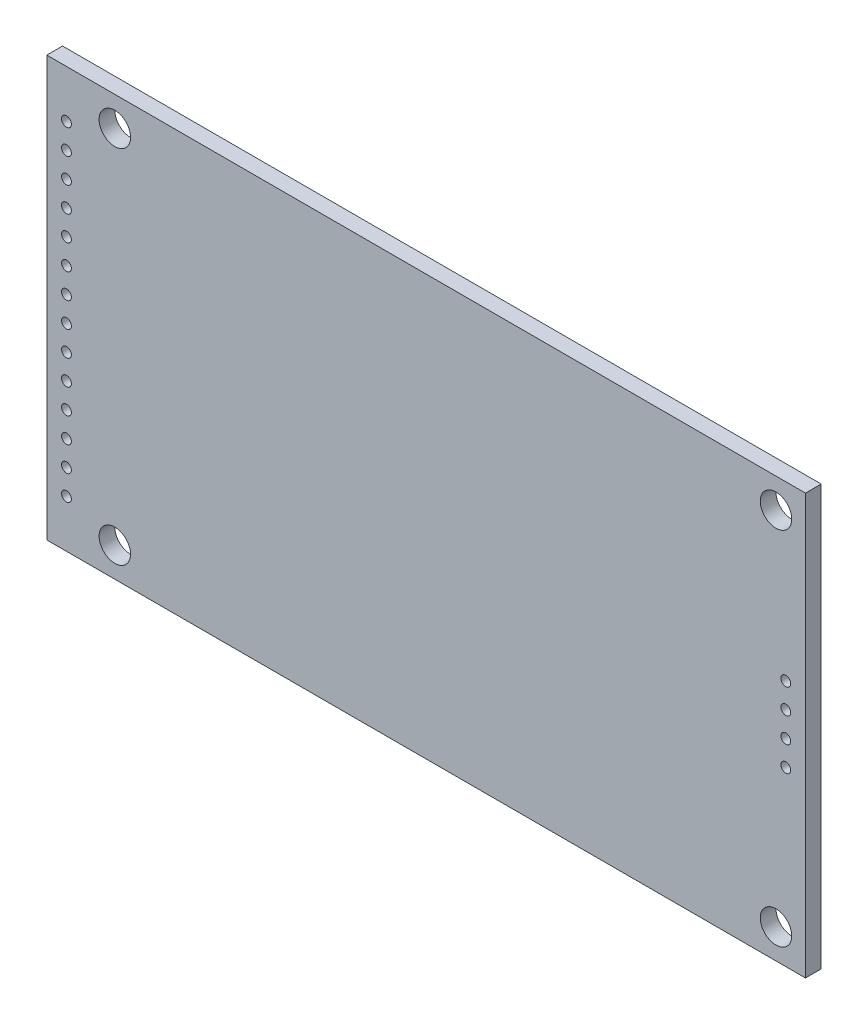
ISO-10303-21;
HEADER;
FILE_DESCRIPTION(('STEP AP214'),'2;1');
FILE_NAME('part.step','',(''),(''),'','','');
FILE_SCHEMA(('AUTOMOTIVE_DESIGN { 1 0 10303 214 1 1 1 1 }'));
ENDSEC;
DATA;
#1=APPLICATION_CONTEXT('core data for automotive mechanical design processes');
#2=APPLICATION_PROTOCOL_DEFINITION('international standard','automotive_design',2000,#1);
#3=PRODUCT_CONTEXT('',#1,'mechanical');
#4=PRODUCT('Part','Part','',(#3));
#5=PRODUCT_RELATED_PRODUCT_CATEGORY('part','',(#4));
#6=PRODUCT_DEFINITION_FORMATION('','',#4);
#7=PRODUCT_DEFINITION_CONTEXT('part definition',#1,'design');
#8=PRODUCT_DEFINITION('design','',#6,#7);
#9=PRODUCT_DEFINITION_SHAPE('','',#8);
#10=(LENGTH_UNIT() NAMED_UNIT(*) SI_UNIT(.MILLI.,.METRE.));
#11=(NAMED_UNIT(*) PLANE_ANGLE_UNIT() SI_UNIT($,.RADIAN.));
#12=(NAMED_UNIT(*) SI_UNIT($,.STERADIAN.) SOLID_ANGLE_UNIT());
#13=UNCERTAINTY_MEASURE_WITH_UNIT(LENGTH_MEASURE(1.E-05),#10,'distance_accuracy_value','');
#14=(GEOMETRIC_REPRESENTATION_CONTEXT(3) GLOBAL_UNCERTAINTY_ASSIGNED_CONTEXT((#13)) GLOBAL_UNIT_ASSIGNED_CONTEXT((#10,
#11,#12)) REPRESENTATION_CONTEXT('',''));
#15=CARTESIAN_POINT('',(0.,0.,0.));
#16=DIRECTION('',(0.,0.,1.));
#17=DIRECTION('',(1.,0.,0.));
#18=AXIS2_PLACEMENT_3D('',#15,#16,#17);
#19=CARTESIAN_POINT('',(2.45403826108749,0.614093810952889,0.));
#20=DIRECTION('',(0.,0.,1.));
#21=DIRECTION('',(1.,0.,0.));
#22=AXIS2_PLACEMENT_3D('',#19,#20,#21);
#23=PLANE('',#22);
#24=CARTESIAN_POINT('',(39.0440382610875,1.88409381095289,0.));
#25=DIRECTION('',(0.,0.,-1.));
#26=DIRECTION('',(1.,0.,0.));
#27=AXIS2_PLACEMENT_3D('',#24,#25,#26);
#28=CIRCLE('',#27,0.5);
#29=CARTESIAN_POINT('',(38.5440382610875,1.88409381095289,0.));
#30=VERTEX_POINT('',#29);
#31=EDGE_CURVE('E260',#30,#30,#28,.T.);
#32=ORIENTED_EDGE('',*,*,#31,.F.);
#33=EDGE_LOOP('',(#32));
#34=FACE_BOUND('',#33,.T.);
#35=CARTESIAN_POINT('',(-34.1359617389125,-8.27590618904711,0.));
#36=DIRECTION('',(0.,0.,-1.));
#37=DIRECTION('',(1.,0.,0.));
#38=AXIS2_PLACEMENT_3D('',#35,#36,#37);
#39=CIRCLE('',#38,0.5);
#40=CARTESIAN_POINT('',(-34.6359617389125,-8.27590618904711,0.));
#41=VERTEX_POINT('',#40);
#42=EDGE_CURVE('E321',#41,#41,#39,.T.);
#43=ORIENTED_EDGE('',*,*,#42,.F.);
#44=EDGE_LOOP('',(#43));
#45=FACE_BOUND('',#44,.T.);
#46=CARTESIAN_POINT('',(-34.1359617389125,4.42409381095289,0.));
#47=DIRECTION('',(0.,0.,-1.));
#48=DIRECTION('',(1.,0.,0.));
#49=AXIS2_PLACEMENT_3D('',#46,#47,#48);
#50=CIRCLE('',#49,0.5);
#51=CARTESIAN_POINT('',(-34.6359617389125,4.42409381095289,0.));
#52=VERTEX_POINT('',#51);
#53=EDGE_CURVE('E370',#52,#52,#50,.T.);
#54=ORIENTED_EDGE('',*,*,#53,.F.);
#55=EDGE_LOOP('',(#54));
#56=FACE_BOUND('',#55,.T.);
#57=CARTESIAN_POINT('',(-29.2152112296125,18.9740938109529,0.));
#58=DIRECTION('',(0.,0.,-1.));
#59=DIRECTION('',(1.,0.,0.));
#60=AXIS2_PLACEMENT_3D('',#57,#58,#59);
#61=CIRCLE('',#60,1.6);
#62=CARTESIAN_POINT('',(-30.8152112296125,18.9740938109529,0.));
#63=VERTEX_POINT('',#62);
#64=EDGE_CURVE('E297',#63,#63,#61,.T.);
#65=ORIENTED_EDGE('',*,*,#64,.F.);
#66=EDGE_LOOP('',(#65));
#67=FACE_BOUND('',#66,.T.);
#68=CARTESIAN_POINT('',(-34.1359617389125,6.96409381095289,0.));
#69=DIRECTION('',(0.,0.,-1.));
#70=DIRECTION('',(1.,0.,0.));
#71=AXIS2_PLACEMENT_3D('',#68,#69,#70);
#72=CIRCLE('',#71,0.5);
#73=CARTESIAN_POINT('',(-34.6359617389125,6.96409381095289,0.));
#74=VERTEX_POINT('',#73);
#75=EDGE_CURVE('E306',#74,#74,#72,.T.);
#76=ORIENTED_EDGE('',*,*,#75,.F.);
#77=EDGE_LOOP('',(#76));
#78=FACE_BOUND('',#77,.T.);
#79=CARTESIAN_POINT('',(38.0440382610875,-17.7459061890471,0.));
#80=DIRECTION('',(0.,0.,-1.));
#81=DIRECTION('',(1.,0.,0.));
#82=AXIS2_PLACEMENT_3D('',#79,#80,#81);
#83=CIRCLE('',#82,1.6);
#84=CARTESIAN_POINT('',(36.4440382610875,-17.7459061890471,0.));
#85=VERTEX_POINT('',#84);
#86=EDGE_CURVE('E144',#85,#85,#83,.T.);
#87=ORIENTED_EDGE('',*,*,#86,.F.);
#88=EDGE_LOOP('',(#87));
#89=FACE_BOUND('',#88,.T.);
#90=CARTESIAN_POINT('',(38.0440382610875,18.9740938109529,0.));
#91=DIRECTION('',(0.,0.,-1.));
#92=DIRECTION('',(1.,0.,0.));
#93=AXIS2_PLACEMENT_3D('',#90,#91,#92);
#94=CIRCLE('',#93,1.6);
#95=CARTESIAN_POINT('',(36.4440382610875,18.9740938109529,0.));
#96=VERTEX_POINT('',#95);
#97=EDGE_CURVE('E127',#96,#96,#94,.T.);
#98=ORIENTED_EDGE('',*,*,#97,.F.);
#99=EDGE_LOOP('',(#98));
#100=FACE_BOUND('',#99,.T.);
#101=CARTESIAN_POINT('',(-34.1359617389125,9.50409381095289,0.));
#102=DIRECTION('',(0.,0.,-1.));
#103=DIRECTION('',(1.,0.,0.));
#104=AXIS2_PLACEMENT_3D('',#101,#102,#103);
#105=CIRCLE('',#104,0.5);
#106=CARTESIAN_POINT('',(-34.6359617389125,9.50409381095289,0.));
#107=VERTEX_POINT('',#106);
#108=EDGE_CURVE('E348',#107,#107,#105,.T.);
#109=ORIENTED_EDGE('',*,*,#108,.F.);
#110=EDGE_LOOP('',(#109));
#111=FACE_BOUND('',#110,.T.);
#112=CARTESIAN_POINT('',(39.0440382610875,-3.19590618904711,0.));
#113=DIRECTION('',(0.,0.,-1.));
#114=DIRECTION('',(1.,0.,0.));
#115=AXIS2_PLACEMENT_3D('',#112,#113,#114);
#116=CIRCLE('',#115,0.5);
#117=CARTESIAN_POINT('',(38.5440382610875,-3.19590618904711,0.));
#118=VERTEX_POINT('',#117);
#119=EDGE_CURVE('E166',#118,#118,#116,.T.);
#120=ORIENTED_EDGE('',*,*,#119,.F.);
#121=EDGE_LOOP('',(#120));
#122=FACE_BOUND('',#121,.T.);
#123=CARTESIAN_POINT('',(39.0440382610875,4.42409381095289,0.));
#124=DIRECTION('',(0.,0.,-1.));
#125=DIRECTION('',(1.,0.,0.));
#126=AXIS2_PLACEMENT_3D('',#123,#124,#125);
#127=CIRCLE('',#126,0.5);
#128=CARTESIAN_POINT('',(38.5440382610875,4.42409381095289,0.));
#129=VERTEX_POINT('',#128);
#130=EDGE_CURVE('E172',#129,#129,#127,.T.);
#131=ORIENTED_EDGE('',*,*,#130,.F.);
#132=EDGE_LOOP('',(#131));
#133=FACE_BOUND('',#132,.T.);
#134=CARTESIAN_POINT('',(39.0440382610875,-0.655906189047109,0.));
#135=DIRECTION('',(0.,0.,-1.));
#136=DIRECTION('',(1.,0.,0.));
#137=AXIS2_PLACEMENT_3D('',#134,#135,#136);
#138=CIRCLE('',#137,0.5);
#139=CARTESIAN_POINT('',(38.5440382610875,-0.655906189047109,0.));
#140=VERTEX_POINT('',#139);
#141=EDGE_CURVE('E317',#140,#140,#138,.T.);
#142=ORIENTED_EDGE('',*,*,#141,.F.);
#143=EDGE_LOOP('',(#142));
#144=FACE_BOUND('',#143,.T.);
#145=CARTESIAN_POINT('',(-34.1359617389125,12.0440938109529,0.));
#146=DIRECTION('',(0.,0.,-1.));
#147=DIRECTION('',(1.,0.,0.));
#148=AXIS2_PLACEMENT_3D('',#145,#146,#147);
#149=CIRCLE('',#148,0.5);
#150=CARTESIAN_POINT('',(-34.6359617389125,12.0440938109529,0.));
#151=VERTEX_POINT('',#150);
#152=EDGE_CURVE('E237',#151,#151,#149,.T.);
#153=ORIENTED_EDGE('',*,*,#152,.F.);
#154=EDGE_LOOP('',(#153));
#155=FACE_BOUND('',#154,.T.);
#156=CARTESIAN_POINT('',(-34.1359617389125,-13.3559061890471,0.));
#157=DIRECTION('',(0.,0.,-1.));
#158=DIRECTION('',(1.,0.,0.));
#159=AXIS2_PLACEMENT_3D('',#156,#157,#158);
#160=CIRCLE('',#159,0.5);
#161=CARTESIAN_POINT('',(-34.6359617389125,-13.3559061890471,0.));
#162=VERTEX_POINT('',#161);
#163=EDGE_CURVE('E244',#162,#162,#160,.T.);
#164=ORIENTED_EDGE('',*,*,#163,.F.);
#165=EDGE_LOOP('',(#164));
#166=FACE_BOUND('',#165,.T.);
#167=CARTESIAN_POINT('',(-34.1359617389125,1.88409381095289,0.));
#168=DIRECTION('',(0.,0.,-1.));
#169=DIRECTION('',(1.,0.,0.));
#170=AXIS2_PLACEMENT_3D('',#167,#168,#169);
#171=CIRCLE('',#170,0.5);
#172=CARTESIAN_POINT('',(-34.6359617389125,1.88409381095289,0.));
#173=VERTEX_POINT('',#172);
#174=EDGE_CURVE('E282',#173,#173,#171,.T.);
#175=ORIENTED_EDGE('',*,*,#174,.F.);
#176=EDGE_LOOP('',(#175));
#177=FACE_BOUND('',#176,.T.);
#178=CARTESIAN_POINT('',(-34.1359617389125,-0.655906189047109,0.));
#179=DIRECTION('',(0.,0.,-1.));
#180=DIRECTION('',(1.,0.,0.));
#181=AXIS2_PLACEMENT_3D('',#178,#179,#180);
#182=CIRCLE('',#181,0.5);
#183=CARTESIAN_POINT('',(-34.6359617389125,-0.655906189047109,0.));
#184=VERTEX_POINT('',#183);
#185=EDGE_CURVE('E379',#184,#184,#182,.T.);
#186=ORIENTED_EDGE('',*,*,#185,.F.);
#187=EDGE_LOOP('',(#186));
#188=FACE_BOUND('',#187,.T.);
#189=CARTESIAN_POINT('',(-34.1359617389125,17.1240938109529,0.));
#190=DIRECTION('',(0.,0.,-1.));
#191=DIRECTION('',(1.,0.,0.));
#192=AXIS2_PLACEMENT_3D('',#189,#190,#191);
#193=CIRCLE('',#192,0.5);
#194=CARTESIAN_POINT('',(-34.6359617389125,17.1240938109529,0.));
#195=VERTEX_POINT('',#194);
#196=EDGE_CURVE('E266',#195,#195,#193,.T.);
#197=ORIENTED_EDGE('',*,*,#196,.F.);
#198=EDGE_LOOP('',(#197));
#199=FACE_BOUND('',#198,.T.);
#200=CARTESIAN_POINT('',(-34.1359617389125,-10.8159061890471,0.));
#201=DIRECTION('',(0.,0.,-1.));
#202=DIRECTION('',(1.,0.,0.));
#203=AXIS2_PLACEMENT_3D('',#200,#201,#202);
#204=CIRCLE('',#203,0.5);
#205=CARTESIAN_POINT('',(-34.6359617389125,-10.8159061890471,0.));
#206=VERTEX_POINT('',#205);
#207=EDGE_CURVE('E207',#206,#206,#204,.T.);
#208=ORIENTED_EDGE('',*,*,#207,.F.);
#209=EDGE_LOOP('',(#208));
#210=FACE_BOUND('',#209,.T.);
#211=CARTESIAN_POINT('',(-29.2159617389125,-17.7459061890471,0.));
#212=DIRECTION('',(0.,0.,-1.));
#213=DIRECTION('',(1.,0.,0.));
#214=AXIS2_PLACEMENT_3D('',#211,#212,#213);
#215=CIRCLE('',#214,1.6);
#216=CARTESIAN_POINT('',(-30.8159617389125,-17.7459061890471,0.));
#217=VERTEX_POINT('',#216);
#218=EDGE_CURVE('E227',#217,#217,#215,.T.);
#219=ORIENTED_EDGE('',*,*,#218,.F.);
#220=EDGE_LOOP('',(#219));
#221=FACE_BOUND('',#220,.T.);
#222=CARTESIAN_POINT('',(-34.1359617389125,14.5840938109529,0.));
#223=DIRECTION('',(0.,0.,-1.));
#224=DIRECTION('',(1.,0.,0.));
#225=AXIS2_PLACEMENT_3D('',#222,#223,#224);
#226=CIRCLE('',#225,0.5);
#227=CARTESIAN_POINT('',(-34.6359617389125,14.5840938109529,0.));
#228=VERTEX_POINT('',#227);
#229=EDGE_CURVE('E199',#228,#228,#226,.T.);
#230=ORIENTED_EDGE('',*,*,#229,.F.);
#231=EDGE_LOOP('',(#230));
#232=FACE_BOUND('',#231,.T.);
#233=CARTESIAN_POINT('',(-34.1359617389125,-5.73590618904711,0.));
#234=DIRECTION('',(0.,0.,-1.));
#235=DIRECTION('',(1.,0.,0.));
#236=AXIS2_PLACEMENT_3D('',#233,#234,#235);
#237=CIRCLE('',#236,0.5);
#238=CARTESIAN_POINT('',(-34.6359617389125,-5.73590618904711,0.));
#239=VERTEX_POINT('',#238);
#240=EDGE_CURVE('E256',#239,#239,#237,.T.);
#241=ORIENTED_EDGE('',*,*,#240,.F.);
#242=EDGE_LOOP('',(#241));
#243=FACE_BOUND('',#242,.T.);
#244=CARTESIAN_POINT('',(-34.1359617389125,-3.19590618904711,0.));
#245=DIRECTION('',(0.,0.,-1.));
#246=DIRECTION('',(1.,0.,0.));
#247=AXIS2_PLACEMENT_3D('',#244,#245,#246);
#248=CIRCLE('',#247,0.5);
#249=CARTESIAN_POINT('',(-34.6359617389125,-3.19590618904711,0.));
#250=VERTEX_POINT('',#249);
#251=EDGE_CURVE('E193',#250,#250,#248,.T.);
#252=ORIENTED_EDGE('',*,*,#251,.F.);
#253=EDGE_LOOP('',(#252));
#254=FACE_BOUND('',#253,.T.);
#255=CARTESIAN_POINT('',(-34.1359617389125,-15.8959061890471,0.));
#256=DIRECTION('',(0.,0.,-1.));
#257=DIRECTION('',(1.,0.,0.));
#258=AXIS2_PLACEMENT_3D('',#255,#256,#257);
#259=CIRCLE('',#258,0.5);
#260=CARTESIAN_POINT('',(-34.6359617389125,-15.8959061890471,0.));
#261=VERTEX_POINT('',#260);
#262=EDGE_CURVE('E173',#261,#261,#259,.T.);
#263=ORIENTED_EDGE('',*,*,#262,.F.);
#264=EDGE_LOOP('',(#263));
#265=FACE_BOUND('',#264,.T.);
#266=DIRECTION('',(-1.,0.,0.));
#267=VECTOR('',#266,1.);
#268=CARTESIAN_POINT('',(41.0440382610875,-20.7459061890471,0.));
#269=LINE('',#268,#267);
#270=CARTESIAN_POINT('',(41.0440382610875,-20.7459061890471,0.));
#271=VERTEX_POINT('',#270);
#272=CARTESIAN_POINT('',(-36.1359617389125,-20.7459061890471,0.));
#273=VERTEX_POINT('',#272);
#274=EDGE_CURVE('E27',#271,#273,#269,.T.);
#275=ORIENTED_EDGE('',*,*,#274,.T.);
#276=DIRECTION('',(0.,1.,0.));
#277=VECTOR('',#276,1.);
#278=CARTESIAN_POINT('',(-36.1359617389125,-20.7459061890471,0.));
#279=LINE('',#278,#277);
#280=CARTESIAN_POINT('',(-36.1359617389125,21.9740938109529,0.));
#281=VERTEX_POINT('',#280);
#282=EDGE_CURVE('E161',#273,#281,#279,.T.);
#283=ORIENTED_EDGE('',*,*,#282,.T.);
#284=DIRECTION('',(1.,0.,0.));
#285=VECTOR('',#284,1.);
#286=CARTESIAN_POINT('',(-36.1359617389125,21.9740938109529,0.));
#287=LINE('',#286,#285);
#288=CARTESIAN_POINT('',(41.0440382610875,21.9740938109529,0.));
#289=VERTEX_POINT('',#288);
#290=EDGE_CURVE('E228',#281,#289,#287,.T.);
#291=ORIENTED_EDGE('',*,*,#290,.T.);
#292=DIRECTION('',(0.,-1.,0.));
#293=VECTOR('',#292,1.);
#294=CARTESIAN_POINT('',(41.0440382610875,21.9740938109529,0.));
#295=LINE('',#294,#293);
#296=EDGE_CURVE('E217',#289,#271,#295,.T.);
#297=ORIENTED_EDGE('',*,*,#296,.T.);
#298=EDGE_LOOP('',(#275,#283,#291,#297));
#299=FACE_BOUND('',#298,.T.);
#300=ADVANCED_FACE('F16',(#34,#45,#56,#67,#78,#89,#100,#111,#122,#133,#144,#155,#166,#177,#188,
#199,#210,#221,#232,#243,#254,#265,#299),#23,.F.);
#301=CARTESIAN_POINT('',(2.45403826108749,0.614093810952889,1.6));
#302=DIRECTION('',(0.,0.,1.));
#303=DIRECTION('',(1.,0.,0.));
#304=AXIS2_PLACEMENT_3D('',#301,#302,#303);
#305=PLANE('',#304);
#306=CARTESIAN_POINT('',(39.0440382610875,1.88409381095289,1.6));
#307=DIRECTION('',(0.,0.,-1.));
#308=DIRECTION('',(1.,0.,0.));
#309=AXIS2_PLACEMENT_3D('',#306,#307,#308);
#310=CIRCLE('',#309,0.5);
#311=CARTESIAN_POINT('',(38.5440382610875,1.88409381095289,1.6));
#312=VERTEX_POINT('',#311);
#313=EDGE_CURVE('E328',#312,#312,#310,.T.);
#314=ORIENTED_EDGE('',*,*,#313,.T.);
#315=EDGE_LOOP('',(#314));
#316=FACE_BOUND('',#315,.T.);
#317=CARTESIAN_POINT('',(-34.1359617389125,-8.27590618904711,1.6));
#318=DIRECTION('',(0.,0.,-1.));
#319=DIRECTION('',(1.,0.,0.));
#320=AXIS2_PLACEMENT_3D('',#317,#318,#319);
#321=CIRCLE('',#320,0.5);
#322=CARTESIAN_POINT('',(-34.6359617389125,-8.27590618904711,1.6));
#323=VERTEX_POINT('',#322);
#324=EDGE_CURVE('E264',#323,#323,#321,.T.);
#325=ORIENTED_EDGE('',*,*,#324,.T.);
#326=EDGE_LOOP('',(#325));
#327=FACE_BOUND('',#326,.T.);
#328=CARTESIAN_POINT('',(-34.1359617389125,4.42409381095289,1.6));
#329=DIRECTION('',(0.,0.,-1.));
#330=DIRECTION('',(1.,0.,0.));
#331=AXIS2_PLACEMENT_3D('',#328,#329,#330);
#332=CIRCLE('',#331,0.5);
#333=CARTESIAN_POINT('',(-34.6359617389125,4.42409381095289,1.6));
#334=VERTEX_POINT('',#333);
#335=EDGE_CURVE('E660',#334,#334,#332,.T.);
#336=ORIENTED_EDGE('',*,*,#335,.T.);
#337=EDGE_LOOP('',(#336));
#338=FACE_BOUND('',#337,.T.);
#339=CARTESIAN_POINT('',(-29.2152112296125,18.9740938109529,1.6));
#340=DIRECTION('',(0.,0.,-1.));
#341=DIRECTION('',(1.,0.,0.));
#342=AXIS2_PLACEMENT_3D('',#339,#340,#341);
#343=CIRCLE('',#342,1.6);
#344=CARTESIAN_POINT('',(-30.8152112296125,18.9740938109529,1.6));
#345=VERTEX_POINT('',#344);
#346=EDGE_CURVE('E374',#345,#345,#343,.T.);
#347=ORIENTED_EDGE('',*,*,#346,.T.);
#348=EDGE_LOOP('',(#347));
#349=FACE_BOUND('',#348,.T.);
#350=CARTESIAN_POINT('',(-34.1359617389125,6.96409381095289,1.6));
#351=DIRECTION('',(0.,0.,-1.));
#352=DIRECTION('',(1.,0.,0.));
#353=AXIS2_PLACEMENT_3D('',#350,#351,#352);
#354=CIRCLE('',#353,0.5);
#355=CARTESIAN_POINT('',(-34.6359617389125,6.96409381095289,1.6));
#356=VERTEX_POINT('',#355);
#357=EDGE_CURVE('E301',#356,#356,#354,.T.);
#358=ORIENTED_EDGE('',*,*,#357,.T.);
#359=EDGE_LOOP('',(#358));
#360=FACE_BOUND('',#359,.T.);
#361=CARTESIAN_POINT('',(38.0440382610875,-17.7459061890471,1.6));
#362=DIRECTION('',(0.,0.,-1.));
#363=DIRECTION('',(1.,0.,0.));
#364=AXIS2_PLACEMENT_3D('',#361,#362,#363);
#365=CIRCLE('',#364,1.6);
#366=CARTESIAN_POINT('',(36.4440382610875,-17.7459061890471,1.6));
#367=VERTEX_POINT('',#366);
#368=EDGE_CURVE('E302',#367,#367,#365,.T.);
#369=ORIENTED_EDGE('',*,*,#368,.T.);
#370=EDGE_LOOP('',(#369));
#371=FACE_BOUND('',#370,.T.);
#372=CARTESIAN_POINT('',(38.0440382610875,18.9740938109529,1.6));
#373=DIRECTION('',(0.,0.,-1.));
#374=DIRECTION('',(1.,0.,0.));
#375=AXIS2_PLACEMENT_3D('',#372,#373,#374);
#376=CIRCLE('',#375,1.6);
#377=CARTESIAN_POINT('',(36.4440382610875,18.9740938109529,1.6));
#378=VERTEX_POINT('',#377);
#379=EDGE_CURVE('E138',#378,#378,#376,.T.);
#380=ORIENTED_EDGE('',*,*,#379,.T.);
#381=EDGE_LOOP('',(#380));
#382=FACE_BOUND('',#381,.T.);
#383=CARTESIAN_POINT('',(-34.1359617389125,9.50409381095289,1.6));
#384=DIRECTION('',(0.,0.,-1.));
#385=DIRECTION('',(1.,0.,0.));
#386=AXIS2_PLACEMENT_3D('',#383,#384,#385);
#387=CIRCLE('',#386,0.5);
#388=CARTESIAN_POINT('',(-34.6359617389125,9.50409381095289,1.6));
#389=VERTEX_POINT('',#388);
#390=EDGE_CURVE('E327',#389,#389,#387,.T.);
#391=ORIENTED_EDGE('',*,*,#390,.T.);
#392=EDGE_LOOP('',(#391));
#393=FACE_BOUND('',#392,.T.);
#394=CARTESIAN_POINT('',(39.0440382610875,-3.19590618904711,1.6));
#395=DIRECTION('',(0.,0.,-1.));
#396=DIRECTION('',(1.,0.,0.));
#397=AXIS2_PLACEMENT_3D('',#394,#395,#396);
#398=CIRCLE('',#397,0.5);
#399=CARTESIAN_POINT('',(38.5440382610875,-3.19590618904711,1.6));
#400=VERTEX_POINT('',#399);
#401=EDGE_CURVE('E167',#400,#400,#398,.T.);
#402=ORIENTED_EDGE('',*,*,#401,.T.);
#403=EDGE_LOOP('',(#402));
#404=FACE_BOUND('',#403,.T.);
#405=CARTESIAN_POINT('',(39.0440382610875,4.42409381095289,1.6));
#406=DIRECTION('',(0.,0.,-1.));
#407=DIRECTION('',(1.,0.,0.));
#408=AXIS2_PLACEMENT_3D('',#405,#406,#407);
#409=CIRCLE('',#408,0.5);
#410=CARTESIAN_POINT('',(38.5440382610875,4.42409381095289,1.6));
#411=VERTEX_POINT('',#410);
#412=EDGE_CURVE('E293',#411,#411,#409,.T.);
#413=ORIENTED_EDGE('',*,*,#412,.T.);
#414=EDGE_LOOP('',(#413));
#415=FACE_BOUND('',#414,.T.);
#416=CARTESIAN_POINT('',(39.0440382610875,-0.655906189047109,1.6));
#417=DIRECTION('',(0.,0.,-1.));
#418=DIRECTION('',(1.,0.,0.));
#419=AXIS2_PLACEMENT_3D('',#416,#417,#418);
#420=CIRCLE('',#419,0.5);
#421=CARTESIAN_POINT('',(38.5440382610875,-0.655906189047109,1.6));
#422=VERTEX_POINT('',#421);
#423=EDGE_CURVE('E168',#422,#422,#420,.T.);
#424=ORIENTED_EDGE('',*,*,#423,.T.);
#425=EDGE_LOOP('',(#424));
#426=FACE_BOUND('',#425,.T.);
#427=CARTESIAN_POINT('',(-34.1359617389125,12.0440938109529,1.6));
#428=DIRECTION('',(0.,0.,-1.));
#429=DIRECTION('',(1.,0.,0.));
#430=AXIS2_PLACEMENT_3D('',#427,#428,#429);
#431=CIRCLE('',#430,0.5);
#432=CARTESIAN_POINT('',(-34.6359617389125,12.0440938109529,1.6));
#433=VERTEX_POINT('',#432);
#434=EDGE_CURVE('E238',#433,#433,#431,.T.);
#435=ORIENTED_EDGE('',*,*,#434,.T.);
#436=EDGE_LOOP('',(#435));
#437=FACE_BOUND('',#436,.T.);
#438=CARTESIAN_POINT('',(-34.1359617389125,-13.3559061890471,1.6));
#439=DIRECTION('',(0.,0.,-1.));
#440=DIRECTION('',(1.,0.,0.));
#441=AXIS2_PLACEMENT_3D('',#438,#439,#440);
#442=CIRCLE('',#441,0.5);
#443=CARTESIAN_POINT('',(-34.6359617389125,-13.3559061890471,1.6));
#444=VERTEX_POINT('',#443);
#445=EDGE_CURVE('E245',#444,#444,#442,.T.);
#446=ORIENTED_EDGE('',*,*,#445,.T.);
#447=EDGE_LOOP('',(#446));
#448=FACE_BOUND('',#447,.T.);
#449=CARTESIAN_POINT('',(-34.1359617389125,1.88409381095289,1.6));
#450=DIRECTION('',(0.,0.,-1.));
#451=DIRECTION('',(1.,0.,0.));
#452=AXIS2_PLACEMENT_3D('',#449,#450,#451);
#453=CIRCLE('',#452,0.5);
#454=CARTESIAN_POINT('',(-34.6359617389125,1.88409381095289,1.6));
#455=VERTEX_POINT('',#454);
#456=EDGE_CURVE('E275',#455,#455,#453,.T.);
#457=ORIENTED_EDGE('',*,*,#456,.T.);
#458=EDGE_LOOP('',(#457));
#459=FACE_BOUND('',#458,.T.);
#460=CARTESIAN_POINT('',(-34.1359617389125,-0.655906189047109,1.6));
#461=DIRECTION('',(0.,0.,-1.));
#462=DIRECTION('',(1.,0.,0.));
#463=AXIS2_PLACEMENT_3D('',#460,#461,#462);
#464=CIRCLE('',#463,0.5);
#465=CARTESIAN_POINT('',(-34.6359617389125,-0.655906189047109,1.6));
#466=VERTEX_POINT('',#465);
#467=EDGE_CURVE('E285',#466,#466,#464,.T.);
#468=ORIENTED_EDGE('',*,*,#467,.T.);
#469=EDGE_LOOP('',(#468));
#470=FACE_BOUND('',#469,.T.);
#471=CARTESIAN_POINT('',(-34.1359617389125,17.1240938109529,1.6));
#472=DIRECTION('',(0.,0.,-1.));
#473=DIRECTION('',(1.,0.,0.));
#474=AXIS2_PLACEMENT_3D('',#471,#472,#473);
#475=CIRCLE('',#474,0.5);
#476=CARTESIAN_POINT('',(-34.6359617389125,17.1240938109529,1.6));
#477=VERTEX_POINT('',#476);
#478=EDGE_CURVE('E383',#477,#477,#475,.T.);
#479=ORIENTED_EDGE('',*,*,#478,.T.);
#480=EDGE_LOOP('',(#479));
#481=FACE_BOUND('',#480,.T.);
#482=CARTESIAN_POINT('',(-34.1359617389125,-10.8159061890471,1.6));
#483=DIRECTION('',(0.,0.,-1.));
#484=DIRECTION('',(1.,0.,0.));
#485=AXIS2_PLACEMENT_3D('',#482,#483,#484);
#486=CIRCLE('',#485,0.5);
#487=CARTESIAN_POINT('',(-34.6359617389125,-10.8159061890471,1.6));
#488=VERTEX_POINT('',#487);
#489=EDGE_CURVE('E208',#488,#488,#486,.T.);
#490=ORIENTED_EDGE('',*,*,#489,.T.);
#491=EDGE_LOOP('',(#490));
#492=FACE_BOUND('',#491,.T.);
#493=CARTESIAN_POINT('',(-29.2159617389125,-17.7459061890471,1.6));
#494=DIRECTION('',(0.,0.,-1.));
#495=DIRECTION('',(1.,0.,0.));
#496=AXIS2_PLACEMENT_3D('',#493,#494,#495);
#497=CIRCLE('',#496,1.6);
#498=CARTESIAN_POINT('',(-30.8159617389125,-17.7459061890471,1.6));
#499=VERTEX_POINT('',#498);
#500=EDGE_CURVE('E363',#499,#499,#497,.T.);
#501=ORIENTED_EDGE('',*,*,#500,.T.);
#502=EDGE_LOOP('',(#501));
#503=FACE_BOUND('',#502,.T.);
#504=CARTESIAN_POINT('',(-34.1359617389125,14.5840938109529,1.6));
#505=DIRECTION('',(0.,0.,-1.));
#506=DIRECTION('',(1.,0.,0.));
#507=AXIS2_PLACEMENT_3D('',#504,#505,#506);
#508=CIRCLE('',#507,0.5);
#509=CARTESIAN_POINT('',(-34.6359617389125,14.5840938109529,1.6));
#510=VERTEX_POINT('',#509);
#511=EDGE_CURVE('E223',#510,#510,#508,.T.);
#512=ORIENTED_EDGE('',*,*,#511,.T.);
#513=EDGE_LOOP('',(#512));
#514=FACE_BOUND('',#513,.T.);
#515=CARTESIAN_POINT('',(-34.1359617389125,-5.73590618904711,1.6));
#516=DIRECTION('',(0.,0.,-1.));
#517=DIRECTION('',(1.,0.,0.));
#518=AXIS2_PLACEMENT_3D('',#515,#516,#517);
#519=CIRCLE('',#518,0.5);
#520=CARTESIAN_POINT('',(-34.6359617389125,-5.73590618904711,1.6));
#521=VERTEX_POINT('',#520);
#522=EDGE_CURVE('E202',#521,#521,#519,.T.);
#523=ORIENTED_EDGE('',*,*,#522,.T.);
#524=EDGE_LOOP('',(#523));
#525=FACE_BOUND('',#524,.T.);
#526=CARTESIAN_POINT('',(-34.1359617389125,-3.19590618904711,1.6));
#527=DIRECTION('',(0.,0.,-1.));
#528=DIRECTION('',(1.,0.,0.));
#529=AXIS2_PLACEMENT_3D('',#526,#527,#528);
#530=CIRCLE('',#529,0.5);
#531=CARTESIAN_POINT('',(-34.6359617389125,-3.19590618904711,1.6));
#532=VERTEX_POINT('',#531);
#533=EDGE_CURVE('E289',#532,#532,#530,.T.);
#534=ORIENTED_EDGE('',*,*,#533,.T.);
#535=EDGE_LOOP('',(#534));
#536=FACE_BOUND('',#535,.T.);
#537=CARTESIAN_POINT('',(-34.1359617389125,-15.8959061890471,1.6));
#538=DIRECTION('',(0.,0.,-1.));
#539=DIRECTION('',(1.,0.,0.));
#540=AXIS2_PLACEMENT_3D('',#537,#538,#539);
#541=CIRCLE('',#540,0.5);
#542=CARTESIAN_POINT('',(-34.6359617389125,-15.8959061890471,1.6));
#543=VERTEX_POINT('',#542);
#544=EDGE_CURVE('E186',#543,#543,#541,.T.);
#545=ORIENTED_EDGE('',*,*,#544,.T.);
#546=EDGE_LOOP('',(#545));
#547=FACE_BOUND('',#546,.T.);
#548=DIRECTION('',(1.,0.,0.));
#549=VECTOR('',#548,1.);
#550=CARTESIAN_POINT('',(41.0440382610875,-20.7459061890471,1.6));
#551=LINE('',#550,#549);
#552=CARTESIAN_POINT('',(-36.1359617389125,-20.7459061890471,1.6));
#553=VERTEX_POINT('',#552);
#554=CARTESIAN_POINT('',(41.0440382610875,-20.7459061890471,1.6));
#555=VERTEX_POINT('',#554);
#556=EDGE_CURVE('E11',#553,#555,#551,.T.);
#557=ORIENTED_EDGE('',*,*,#556,.T.);
#558=DIRECTION('',(0.,1.,0.));
#559=VECTOR('',#558,1.);
#560=CARTESIAN_POINT('',(41.0440382610875,21.9740938109529,1.6));
#561=LINE('',#560,#559);
#562=CARTESIAN_POINT('',(41.0440382610875,21.9740938109529,1.6));
#563=VERTEX_POINT('',#562);
#564=EDGE_CURVE('E221',#555,#563,#561,.T.);
#565=ORIENTED_EDGE('',*,*,#564,.T.);
#566=DIRECTION('',(-1.,0.,0.));
#567=VECTOR('',#566,1.);
#568=CARTESIAN_POINT('',(-36.1359617389125,21.9740938109529,1.6));
#569=LINE('',#568,#567);
#570=CARTESIAN_POINT('',(-36.1359617389125,21.9740938109529,1.6));
#571=VERTEX_POINT('',#570);
#572=EDGE_CURVE('E232',#563,#571,#569,.T.);
#573=ORIENTED_EDGE('',*,*,#572,.T.);
#574=DIRECTION('',(0.,-1.,0.));
#575=VECTOR('',#574,1.);
#576=CARTESIAN_POINT('',(-36.1359617389125,-20.7459061890471,1.6));
#577=LINE('',#576,#575);
#578=EDGE_CURVE('E160',#571,#553,#577,.T.);
#579=ORIENTED_EDGE('',*,*,#578,.T.);
#580=EDGE_LOOP('',(#557,#565,#573,#579));
#581=FACE_BOUND('',#580,.T.);
#582=ADVANCED_FACE('F18',(#316,#327,#338,#349,#360,#371,#382,#393,#404,#415,#426,#437,#448,#459,
#470,#481,#492,#503,#514,#525,#536,#547,#581),#305,.T.);
#583=CARTESIAN_POINT('',(-36.1359617389125,-20.7459061890471,0.));
#584=DIRECTION('',(0.,-1.,0.));
#585=DIRECTION('',(0.,0.,-1.));
#586=AXIS2_PLACEMENT_3D('',#583,#584,#585);
#587=PLANE('',#586);
#588=ORIENTED_EDGE('',*,*,#274,.F.);
#589=DIRECTION('',(0.,0.,1.));
#590=VECTOR('',#589,1.);
#591=CARTESIAN_POINT('',(41.0440382610875,-20.7459061890471,0.));
#592=LINE('',#591,#590);
#593=EDGE_CURVE('E257',#271,#555,#592,.T.);
#594=ORIENTED_EDGE('',*,*,#593,.T.);
#595=ORIENTED_EDGE('',*,*,#556,.F.);
#596=DIRECTION('',(0.,0.,1.));
#597=VECTOR('',#596,1.);
#598=CARTESIAN_POINT('',(-36.1359617389125,-20.7459061890471,0.));
#599=LINE('',#598,#597);
#600=EDGE_CURVE('E156',#273,#553,#599,.T.);
#601=ORIENTED_EDGE('',*,*,#600,.F.);
#602=EDGE_LOOP('',(#588,#594,#595,#601));
#603=FACE_BOUND('',#602,.T.);
#604=ADVANCED_FACE('F446',(#603),#587,.T.);
#605=CARTESIAN_POINT('',(41.0440382610875,-20.7459061890471,0.));
#606=DIRECTION('',(1.,0.,0.));
#607=DIRECTION('',(0.,1.,0.));
#608=AXIS2_PLACEMENT_3D('',#605,#606,#607);
#609=PLANE('',#608);
#610=ORIENTED_EDGE('',*,*,#296,.F.);
#611=DIRECTION('',(0.,0.,1.));
#612=VECTOR('',#611,1.);
#613=CARTESIAN_POINT('',(41.0440382610875,21.9740938109529,0.));
#614=LINE('',#613,#612);
#615=EDGE_CURVE('E222',#289,#563,#614,.T.);
#616=ORIENTED_EDGE('',*,*,#615,.T.);
#617=ORIENTED_EDGE('',*,*,#564,.F.);
#618=ORIENTED_EDGE('',*,*,#593,.F.);
#619=EDGE_LOOP('',(#610,#616,#617,#618));
#620=FACE_BOUND('',#619,.T.);
#621=ADVANCED_FACE('F641',(#620),#609,.T.);
#622=CARTESIAN_POINT('',(41.0440382610875,21.9740938109529,0.));
#623=DIRECTION('',(0.,1.,0.));
#624=DIRECTION('',(1.,0.,0.));
#625=AXIS2_PLACEMENT_3D('',#622,#623,#624);
#626=PLANE('',#625);
#627=ORIENTED_EDGE('',*,*,#290,.F.);
#628=DIRECTION('',(0.,0.,1.));
#629=VECTOR('',#628,1.);
#630=CARTESIAN_POINT('',(-36.1359617389125,21.9740938109529,0.));
#631=LINE('',#630,#629);
#632=EDGE_CURVE('E233',#281,#571,#631,.T.);
#633=ORIENTED_EDGE('',*,*,#632,.T.);
#634=ORIENTED_EDGE('',*,*,#572,.F.);
#635=ORIENTED_EDGE('',*,*,#615,.F.);
#636=EDGE_LOOP('',(#627,#633,#634,#635));
#637=FACE_BOUND('',#636,.T.);
#638=ADVANCED_FACE('F454',(#637),#626,.T.);
#639=CARTESIAN_POINT('',(-36.1359617389125,21.9740938109529,0.));
#640=DIRECTION('',(-1.,0.,0.));
#641=DIRECTION('',(0.,0.,1.));
#642=AXIS2_PLACEMENT_3D('',#639,#640,#641);
#643=PLANE('',#642);
#644=ORIENTED_EDGE('',*,*,#282,.F.);
#645=ORIENTED_EDGE('',*,*,#600,.T.);
#646=ORIENTED_EDGE('',*,*,#578,.F.);
#647=ORIENTED_EDGE('',*,*,#632,.F.);
#648=EDGE_LOOP('',(#644,#645,#646,#647));
#649=FACE_BOUND('',#648,.T.);
#650=ADVANCED_FACE('F450',(#649),#643,.T.);
#651=CARTESIAN_POINT('',(-34.1359617389125,-15.8959061890471,0.));
#652=DIRECTION('',(0.,0.,1.));
#653=DIRECTION('',(1.,0.,0.));
#654=AXIS2_PLACEMENT_3D('',#651,#652,#653);
#655=CYLINDRICAL_SURFACE('',#654,0.5);
#656=ORIENTED_EDGE('',*,*,#544,.F.);
#657=DIRECTION('',(0.,0.,-1.));
#658=VECTOR('',#657,1.);
#659=CARTESIAN_POINT('',(-34.6359617389125,-15.8959061890471,0.));
#660=LINE('',#659,#658);
#661=EDGE_CURVE('E175',#543,#261,#660,.T.);
#662=ORIENTED_EDGE('',*,*,#661,.T.);
#663=ORIENTED_EDGE('',*,*,#262,.T.);
#664=ORIENTED_EDGE('',*,*,#661,.F.);
#665=EDGE_LOOP('',(#656,#662,#663,#664));
#666=FACE_BOUND('',#665,.T.);
#667=ADVANCED_FACE('F560',(#666),#655,.F.);
#668=CARTESIAN_POINT('',(-34.1359617389125,-3.19590618904711,0.));
#669=DIRECTION('',(0.,0.,1.));
#670=DIRECTION('',(1.,0.,0.));
#671=AXIS2_PLACEMENT_3D('',#668,#669,#670);
#672=CYLINDRICAL_SURFACE('',#671,0.5);
#673=ORIENTED_EDGE('',*,*,#533,.F.);
#674=DIRECTION('',(0.,0.,-1.));
#675=VECTOR('',#674,1.);
#676=CARTESIAN_POINT('',(-34.6359617389125,-3.19590618904711,0.));
#677=LINE('',#676,#675);
#678=EDGE_CURVE('E216',#532,#250,#677,.T.);
#679=ORIENTED_EDGE('',*,*,#678,.T.);
#680=ORIENTED_EDGE('',*,*,#251,.T.);
#681=ORIENTED_EDGE('',*,*,#678,.F.);
#682=EDGE_LOOP('',(#673,#679,#680,#681));
#683=FACE_BOUND('',#682,.T.);
#684=ADVANCED_FACE('F562',(#683),#672,.F.);
#685=CARTESIAN_POINT('',(-34.1359617389125,-5.73590618904711,0.));
#686=DIRECTION('',(0.,0.,1.));
#687=DIRECTION('',(1.,0.,0.));
#688=AXIS2_PLACEMENT_3D('',#685,#686,#687);
#689=CYLINDRICAL_SURFACE('',#688,0.5);
#690=ORIENTED_EDGE('',*,*,#522,.F.);
#691=DIRECTION('',(0.,0.,-1.));
#692=VECTOR('',#691,1.);
#693=CARTESIAN_POINT('',(-34.6359617389125,-5.73590618904711,0.));
#694=LINE('',#693,#692);
#695=EDGE_CURVE('E212',#521,#239,#694,.T.);
#696=ORIENTED_EDGE('',*,*,#695,.T.);
#697=ORIENTED_EDGE('',*,*,#240,.T.);
#698=ORIENTED_EDGE('',*,*,#695,.F.);
#699=EDGE_LOOP('',(#690,#696,#697,#698));
#700=FACE_BOUND('',#699,.T.);
#701=ADVANCED_FACE('F569',(#700),#689,.F.);
#702=CARTESIAN_POINT('',(-34.1359617389125,14.5840938109529,0.));
#703=DIRECTION('',(0.,0.,1.));
#704=DIRECTION('',(1.,0.,0.));
#705=AXIS2_PLACEMENT_3D('',#702,#703,#704);
#706=CYLINDRICAL_SURFACE('',#705,0.5);
#707=ORIENTED_EDGE('',*,*,#511,.F.);
#708=DIRECTION('',(0.,0.,-1.));
#709=VECTOR('',#708,1.);
#710=CARTESIAN_POINT('',(-34.6359617389125,14.5840938109529,0.));
#711=LINE('',#710,#709);
#712=EDGE_CURVE('E20',#510,#228,#711,.T.);
#713=ORIENTED_EDGE('',*,*,#712,.T.);
#714=ORIENTED_EDGE('',*,*,#229,.T.);
#715=ORIENTED_EDGE('',*,*,#712,.F.);
#716=EDGE_LOOP('',(#707,#713,#714,#715));
#717=FACE_BOUND('',#716,.T.);
#718=ADVANCED_FACE('F634',(#717),#706,.F.);
#719=CARTESIAN_POINT('',(-29.2159617389125,-17.7459061890471,0.));
#720=DIRECTION('',(0.,0.,1.));
#721=DIRECTION('',(1.,0.,0.));
#722=AXIS2_PLACEMENT_3D('',#719,#720,#721);
#723=CYLINDRICAL_SURFACE('',#722,1.6);
#724=ORIENTED_EDGE('',*,*,#500,.F.);
#725=DIRECTION('',(0.,0.,-1.));
#726=VECTOR('',#725,1.);
#727=CARTESIAN_POINT('',(-30.8159617389125,-17.7459061890471,0.));
#728=LINE('',#727,#726);
#729=EDGE_CURVE('E357',#499,#217,#728,.T.);
#730=ORIENTED_EDGE('',*,*,#729,.T.);
#731=ORIENTED_EDGE('',*,*,#218,.T.);
#732=ORIENTED_EDGE('',*,*,#729,.F.);
#733=EDGE_LOOP('',(#724,#730,#731,#732));
#734=FACE_BOUND('',#733,.T.);
#735=ADVANCED_FACE('F597',(#734),#723,.F.);
#736=CARTESIAN_POINT('',(-34.1359617389125,-10.8159061890471,0.));
#737=DIRECTION('',(0.,0.,1.));
#738=DIRECTION('',(1.,0.,0.));
#739=AXIS2_PLACEMENT_3D('',#736,#737,#738);
#740=CYLINDRICAL_SURFACE('',#739,0.5);
#741=ORIENTED_EDGE('',*,*,#489,.F.);
#742=DIRECTION('',(0.,0.,-1.));
#743=VECTOR('',#742,1.);
#744=CARTESIAN_POINT('',(-34.6359617389125,-10.8159061890471,0.));
#745=LINE('',#744,#743);
#746=EDGE_CURVE('E203',#488,#206,#745,.T.);
#747=ORIENTED_EDGE('',*,*,#746,.T.);
#748=ORIENTED_EDGE('',*,*,#207,.T.);
#749=ORIENTED_EDGE('',*,*,#746,.F.);
#750=EDGE_LOOP('',(#741,#747,#748,#749));
#751=FACE_BOUND('',#750,.T.);
#752=ADVANCED_FACE('F546',(#751),#740,.F.);
#753=CARTESIAN_POINT('',(-34.1359617389125,17.1240938109529,0.));
#754=DIRECTION('',(0.,0.,1.));
#755=DIRECTION('',(1.,0.,0.));
#756=AXIS2_PLACEMENT_3D('',#753,#754,#755);
#757=CYLINDRICAL_SURFACE('',#756,0.5);
#758=ORIENTED_EDGE('',*,*,#478,.F.);
#759=DIRECTION('',(0.,0.,-1.));
#760=VECTOR('',#759,1.);
#761=CARTESIAN_POINT('',(-34.6359617389125,17.1240938109529,0.));
#762=LINE('',#761,#760);
#763=EDGE_CURVE('E269',#477,#195,#762,.T.);
#764=ORIENTED_EDGE('',*,*,#763,.T.);
#765=ORIENTED_EDGE('',*,*,#196,.T.);
#766=ORIENTED_EDGE('',*,*,#763,.F.);
#767=EDGE_LOOP('',(#758,#764,#765,#766));
#768=FACE_BOUND('',#767,.T.);
#769=ADVANCED_FACE('F596',(#768),#757,.F.);
#770=CARTESIAN_POINT('',(-34.1359617389125,-0.655906189047109,0.));
#771=DIRECTION('',(0.,0.,1.));
#772=DIRECTION('',(1.,0.,0.));
#773=AXIS2_PLACEMENT_3D('',#770,#771,#772);
#774=CYLINDRICAL_SURFACE('',#773,0.5);
#775=ORIENTED_EDGE('',*,*,#467,.F.);
#776=DIRECTION('',(0.,0.,-1.));
#777=VECTOR('',#776,1.);
#778=CARTESIAN_POINT('',(-34.6359617389125,-0.655906189047109,0.));
#779=LINE('',#778,#777);
#780=EDGE_CURVE('E154',#466,#184,#779,.T.);
#781=ORIENTED_EDGE('',*,*,#780,.T.);
#782=ORIENTED_EDGE('',*,*,#185,.T.);
#783=ORIENTED_EDGE('',*,*,#780,.F.);
#784=EDGE_LOOP('',(#775,#781,#782,#783));
#785=FACE_BOUND('',#784,.T.);
#786=ADVANCED_FACE('F602',(#785),#774,.F.);
#787=CARTESIAN_POINT('',(-34.1359617389125,1.88409381095289,0.));
#788=DIRECTION('',(0.,0.,1.));
#789=DIRECTION('',(1.,0.,0.));
#790=AXIS2_PLACEMENT_3D('',#787,#788,#789);
#791=CYLINDRICAL_SURFACE('',#790,0.5);
#792=ORIENTED_EDGE('',*,*,#456,.F.);
#793=DIRECTION('',(0.,0.,-1.));
#794=VECTOR('',#793,1.);
#795=CARTESIAN_POINT('',(-34.6359617389125,1.88409381095289,0.));
#796=LINE('',#795,#794);
#797=EDGE_CURVE('E279',#455,#173,#796,.T.);
#798=ORIENTED_EDGE('',*,*,#797,.T.);
#799=ORIENTED_EDGE('',*,*,#174,.T.);
#800=ORIENTED_EDGE('',*,*,#797,.F.);
#801=EDGE_LOOP('',(#792,#798,#799,#800));
#802=FACE_BOUND('',#801,.T.);
#803=ADVANCED_FACE('F607',(#802),#791,.F.);
#804=CARTESIAN_POINT('',(-34.1359617389125,-13.3559061890471,0.));
#805=DIRECTION('',(0.,0.,1.));
#806=DIRECTION('',(1.,0.,0.));
#807=AXIS2_PLACEMENT_3D('',#804,#805,#806);
#808=CYLINDRICAL_SURFACE('',#807,0.5);
#809=ORIENTED_EDGE('',*,*,#445,.F.);
#810=DIRECTION('',(0.,0.,-1.));
#811=VECTOR('',#810,1.);
#812=CARTESIAN_POINT('',(-34.6359617389125,-13.3559061890471,0.));
#813=LINE('',#812,#811);
#814=EDGE_CURVE('E240',#444,#162,#813,.T.);
#815=ORIENTED_EDGE('',*,*,#814,.T.);
#816=ORIENTED_EDGE('',*,*,#163,.T.);
#817=ORIENTED_EDGE('',*,*,#814,.F.);
#818=EDGE_LOOP('',(#809,#815,#816,#817));
#819=FACE_BOUND('',#818,.T.);
#820=ADVANCED_FACE('F408',(#819),#808,.F.);
#821=CARTESIAN_POINT('',(-34.1359617389125,12.0440938109529,0.));
#822=DIRECTION('',(0.,0.,1.));
#823=DIRECTION('',(1.,0.,0.));
#824=AXIS2_PLACEMENT_3D('',#821,#822,#823);
#825=CYLINDRICAL_SURFACE('',#824,0.5);
#826=ORIENTED_EDGE('',*,*,#434,.F.);
#827=DIRECTION('',(0.,0.,-1.));
#828=VECTOR('',#827,1.);
#829=CARTESIAN_POINT('',(-34.6359617389125,12.0440938109529,0.));
#830=LINE('',#829,#828);
#831=EDGE_CURVE('E234',#433,#151,#830,.T.);
#832=ORIENTED_EDGE('',*,*,#831,.T.);
#833=ORIENTED_EDGE('',*,*,#152,.T.);
#834=ORIENTED_EDGE('',*,*,#831,.F.);
#835=EDGE_LOOP('',(#826,#832,#833,#834));
#836=FACE_BOUND('',#835,.T.);
#837=ADVANCED_FACE('F584',(#836),#825,.F.);
#838=CARTESIAN_POINT('',(39.0440382610875,-0.655906189047109,0.));
#839=DIRECTION('',(0.,0.,1.));
#840=DIRECTION('',(1.,0.,0.));
#841=AXIS2_PLACEMENT_3D('',#838,#839,#840);
#842=CYLINDRICAL_SURFACE('',#841,0.5);
#843=ORIENTED_EDGE('',*,*,#423,.F.);
#844=DIRECTION('',(0.,0.,-1.));
#845=VECTOR('',#844,1.);
#846=CARTESIAN_POINT('',(38.5440382610875,-0.655906189047109,0.));
#847=LINE('',#846,#845);
#848=EDGE_CURVE('E171',#422,#140,#847,.T.);
#849=ORIENTED_EDGE('',*,*,#848,.T.);
#850=ORIENTED_EDGE('',*,*,#141,.T.);
#851=ORIENTED_EDGE('',*,*,#848,.F.);
#852=EDGE_LOOP('',(#843,#849,#850,#851));
#853=FACE_BOUND('',#852,.T.);
#854=ADVANCED_FACE('F587',(#853),#842,.F.);
#855=CARTESIAN_POINT('',(39.0440382610875,4.42409381095289,0.));
#856=DIRECTION('',(0.,0.,1.));
#857=DIRECTION('',(1.,0.,0.));
#858=AXIS2_PLACEMENT_3D('',#855,#856,#857);
#859=CYLINDRICAL_SURFACE('',#858,0.5);
#860=ORIENTED_EDGE('',*,*,#412,.F.);
#861=DIRECTION('',(0.,0.,-1.));
#862=VECTOR('',#861,1.);
#863=CARTESIAN_POINT('',(38.5440382610875,4.42409381095289,0.));
#864=LINE('',#863,#862);
#865=EDGE_CURVE('E248',#411,#129,#864,.T.);
#866=ORIENTED_EDGE('',*,*,#865,.T.);
#867=ORIENTED_EDGE('',*,*,#130,.T.);
#868=ORIENTED_EDGE('',*,*,#865,.F.);
#869=EDGE_LOOP('',(#860,#866,#867,#868));
#870=FACE_BOUND('',#869,.T.);
#871=ADVANCED_FACE('F589',(#870),#859,.F.);
#872=CARTESIAN_POINT('',(39.0440382610875,-3.19590618904711,0.));
#873=DIRECTION('',(0.,0.,1.));
#874=DIRECTION('',(1.,0.,0.));
#875=AXIS2_PLACEMENT_3D('',#872,#873,#874);
#876=CYLINDRICAL_SURFACE('',#875,0.5);
#877=ORIENTED_EDGE('',*,*,#401,.F.);
#878=DIRECTION('',(0.,0.,-1.));
#879=VECTOR('',#878,1.);
#880=CARTESIAN_POINT('',(38.5440382610875,-3.19590618904711,0.));
#881=LINE('',#880,#879);
#882=EDGE_CURVE('E162',#400,#118,#881,.T.);
#883=ORIENTED_EDGE('',*,*,#882,.T.);
#884=ORIENTED_EDGE('',*,*,#119,.T.);
#885=ORIENTED_EDGE('',*,*,#882,.F.);
#886=EDGE_LOOP('',(#877,#883,#884,#885));
#887=FACE_BOUND('',#886,.T.);
#888=ADVANCED_FACE('F592',(#887),#876,.F.);
#889=CARTESIAN_POINT('',(-34.1359617389125,9.50409381095289,0.));
#890=DIRECTION('',(0.,0.,1.));
#891=DIRECTION('',(1.,0.,0.));
#892=AXIS2_PLACEMENT_3D('',#889,#890,#891);
#893=CYLINDRICAL_SURFACE('',#892,0.5);
#894=ORIENTED_EDGE('',*,*,#390,.F.);
#895=DIRECTION('',(0.,0.,-1.));
#896=VECTOR('',#895,1.);
#897=CARTESIAN_POINT('',(-34.6359617389125,9.50409381095289,0.));
#898=LINE('',#897,#896);
#899=EDGE_CURVE('E341',#389,#107,#898,.T.);
#900=ORIENTED_EDGE('',*,*,#899,.T.);
#901=ORIENTED_EDGE('',*,*,#108,.T.);
#902=ORIENTED_EDGE('',*,*,#899,.F.);
#903=EDGE_LOOP('',(#894,#900,#901,#902));
#904=FACE_BOUND('',#903,.T.);
#905=ADVANCED_FACE('F583',(#904),#893,.F.);
#906=CARTESIAN_POINT('',(38.0440382610875,18.9740938109529,0.));
#907=DIRECTION('',(0.,0.,1.));
#908=DIRECTION('',(1.,0.,0.));
#909=AXIS2_PLACEMENT_3D('',#906,#907,#908);
#910=CYLINDRICAL_SURFACE('',#909,1.6);
#911=ORIENTED_EDGE('',*,*,#379,.F.);
#912=DIRECTION('',(0.,0.,-1.));
#913=VECTOR('',#912,1.);
#914=CARTESIAN_POINT('',(36.4440382610875,18.9740938109529,0.));
#915=LINE('',#914,#913);
#916=EDGE_CURVE('E135',#378,#96,#915,.T.);
#917=ORIENTED_EDGE('',*,*,#916,.T.);
#918=ORIENTED_EDGE('',*,*,#97,.T.);
#919=ORIENTED_EDGE('',*,*,#916,.F.);
#920=EDGE_LOOP('',(#911,#917,#918,#919));
#921=FACE_BOUND('',#920,.T.);
#922=ADVANCED_FACE('F137',(#921),#910,.F.);
#923=CARTESIAN_POINT('',(38.0440382610875,-17.7459061890471,0.));
#924=DIRECTION('',(0.,0.,1.));
#925=DIRECTION('',(1.,0.,0.));
#926=AXIS2_PLACEMENT_3D('',#923,#924,#925);
#927=CYLINDRICAL_SURFACE('',#926,1.6);
#928=ORIENTED_EDGE('',*,*,#368,.F.);
#929=DIRECTION('',(0.,0.,-1.));
#930=VECTOR('',#929,1.);
#931=CARTESIAN_POINT('',(36.4440382610875,-17.7459061890471,0.));
#932=LINE('',#931,#930);
#933=EDGE_CURVE('E150',#367,#85,#932,.T.);
#934=ORIENTED_EDGE('',*,*,#933,.T.);
#935=ORIENTED_EDGE('',*,*,#86,.T.);
#936=ORIENTED_EDGE('',*,*,#933,.F.);
#937=EDGE_LOOP('',(#928,#934,#935,#936));
#938=FACE_BOUND('',#937,.T.);
#939=ADVANCED_FACE('F576',(#938),#927,.F.);
#940=CARTESIAN_POINT('',(-34.1359617389125,6.96409381095289,0.));
#941=DIRECTION('',(0.,0.,1.));
#942=DIRECTION('',(1.,0.,0.));
#943=AXIS2_PLACEMENT_3D('',#940,#941,#942);
#944=CYLINDRICAL_SURFACE('',#943,0.5);
#945=ORIENTED_EDGE('',*,*,#357,.F.);
#946=DIRECTION('',(0.,0.,-1.));
#947=VECTOR('',#946,1.);
#948=CARTESIAN_POINT('',(-34.6359617389125,6.96409381095289,0.));
#949=LINE('',#948,#947);
#950=EDGE_CURVE('E310',#356,#74,#949,.T.);
#951=ORIENTED_EDGE('',*,*,#950,.T.);
#952=ORIENTED_EDGE('',*,*,#75,.T.);
#953=ORIENTED_EDGE('',*,*,#950,.F.);
#954=EDGE_LOOP('',(#945,#951,#952,#953));
#955=FACE_BOUND('',#954,.T.);
#956=ADVANCED_FACE('F579',(#955),#944,.F.);
#957=CARTESIAN_POINT('',(-29.2152112296125,18.9740938109529,0.));
#958=DIRECTION('',(0.,0.,1.));
#959=DIRECTION('',(1.,0.,0.));
#960=AXIS2_PLACEMENT_3D('',#957,#958,#959);
#961=CYLINDRICAL_SURFACE('',#960,1.6);
#962=ORIENTED_EDGE('',*,*,#346,.F.);
#963=DIRECTION('',(0.,0.,-1.));
#964=VECTOR('',#963,1.);
#965=CARTESIAN_POINT('',(-30.8152112296125,18.9740938109529,0.));
#966=LINE('',#965,#964);
#967=EDGE_CURVE('E197',#345,#63,#966,.T.);
#968=ORIENTED_EDGE('',*,*,#967,.T.);
#969=ORIENTED_EDGE('',*,*,#64,.T.);
#970=ORIENTED_EDGE('',*,*,#967,.F.);
#971=EDGE_LOOP('',(#962,#968,#969,#970));
#972=FACE_BOUND('',#971,.T.);
#973=ADVANCED_FACE('F613',(#972),#961,.F.);
#974=CARTESIAN_POINT('',(-34.1359617389125,4.42409381095289,0.));
#975=DIRECTION('',(0.,0.,1.));
#976=DIRECTION('',(1.,0.,0.));
#977=AXIS2_PLACEMENT_3D('',#974,#975,#976);
#978=CYLINDRICAL_SURFACE('',#977,0.5);
#979=ORIENTED_EDGE('',*,*,#335,.F.);
#980=DIRECTION('',(0.,0.,-1.));
#981=VECTOR('',#980,1.);
#982=CARTESIAN_POINT('',(-34.6359617389125,4.42409381095289,0.));
#983=LINE('',#982,#981);
#984=EDGE_CURVE('E375',#334,#52,#983,.T.);
#985=ORIENTED_EDGE('',*,*,#984,.T.);
#986=ORIENTED_EDGE('',*,*,#53,.T.);
#987=ORIENTED_EDGE('',*,*,#984,.F.);
#988=EDGE_LOOP('',(#979,#985,#986,#987));
#989=FACE_BOUND('',#988,.T.);
#990=ADVANCED_FACE('F619',(#989),#978,.F.);
#991=CARTESIAN_POINT('',(-34.1359617389125,-8.27590618904711,0.));
#992=DIRECTION('',(0.,0.,1.));
#993=DIRECTION('',(1.,0.,0.));
#994=AXIS2_PLACEMENT_3D('',#991,#992,#993);
#995=CYLINDRICAL_SURFACE('',#994,0.5);
#996=ORIENTED_EDGE('',*,*,#324,.F.);
#997=DIRECTION('',(0.,0.,-1.));
#998=VECTOR('',#997,1.);
#999=CARTESIAN_POINT('',(-34.6359617389125,-8.27590618904711,0.));
#1000=LINE('',#999,#998);
#1001=EDGE_CURVE('E274',#323,#41,#1000,.T.);
#1002=ORIENTED_EDGE('',*,*,#1001,.T.);
#1003=ORIENTED_EDGE('',*,*,#42,.T.);
#1004=ORIENTED_EDGE('',*,*,#1001,.F.);
#1005=EDGE_LOOP('',(#996,#1002,#1003,#1004));
#1006=FACE_BOUND('',#1005,.T.);
#1007=ADVANCED_FACE('F615',(#1006),#995,.F.);
#1008=CARTESIAN_POINT('',(39.0440382610875,1.88409381095289,0.));
#1009=DIRECTION('',(0.,0.,1.));
#1010=DIRECTION('',(1.,0.,0.));
#1011=AXIS2_PLACEMENT_3D('',#1008,#1009,#1010);
#1012=CYLINDRICAL_SURFACE('',#1011,0.5);
#1013=ORIENTED_EDGE('',*,*,#313,.F.);
#1014=DIRECTION('',(0.,0.,-1.));
#1015=VECTOR('',#1014,1.);
#1016=CARTESIAN_POINT('',(38.5440382610875,1.88409381095289,0.));
#1017=LINE('',#1016,#1015);
#1018=EDGE_CURVE('E265',#312,#30,#1017,.T.);
#1019=ORIENTED_EDGE('',*,*,#1018,.T.);
#1020=ORIENTED_EDGE('',*,*,#31,.T.);
#1021=ORIENTED_EDGE('',*,*,#1018,.F.);
#1022=EDGE_LOOP('',(#1013,#1019,#1020,#1021));
#1023=FACE_BOUND('',#1022,.T.);
#1024=ADVANCED_FACE('F618',(#1023),#1012,.F.);
#1025=CLOSED_SHELL('',(#300,#582,#604,#621,#638,#650,#667,#684,#701,#718,#735,#752,#769,#786,
#803,#820,#837,#854,#871,#888,#905,#922,#939,#956,#973,#990,#1007,#1024));
#1026=MANIFOLD_SOLID_BREP('B1',#1025);
#1027=ADVANCED_BREP_SHAPE_REPRESENTATION('',(#18,#1026),#14);
#1028=SHAPE_DEFINITION_REPRESENTATION(#9,#1027);
ENDSEC;
END-ISO-10303-21;
